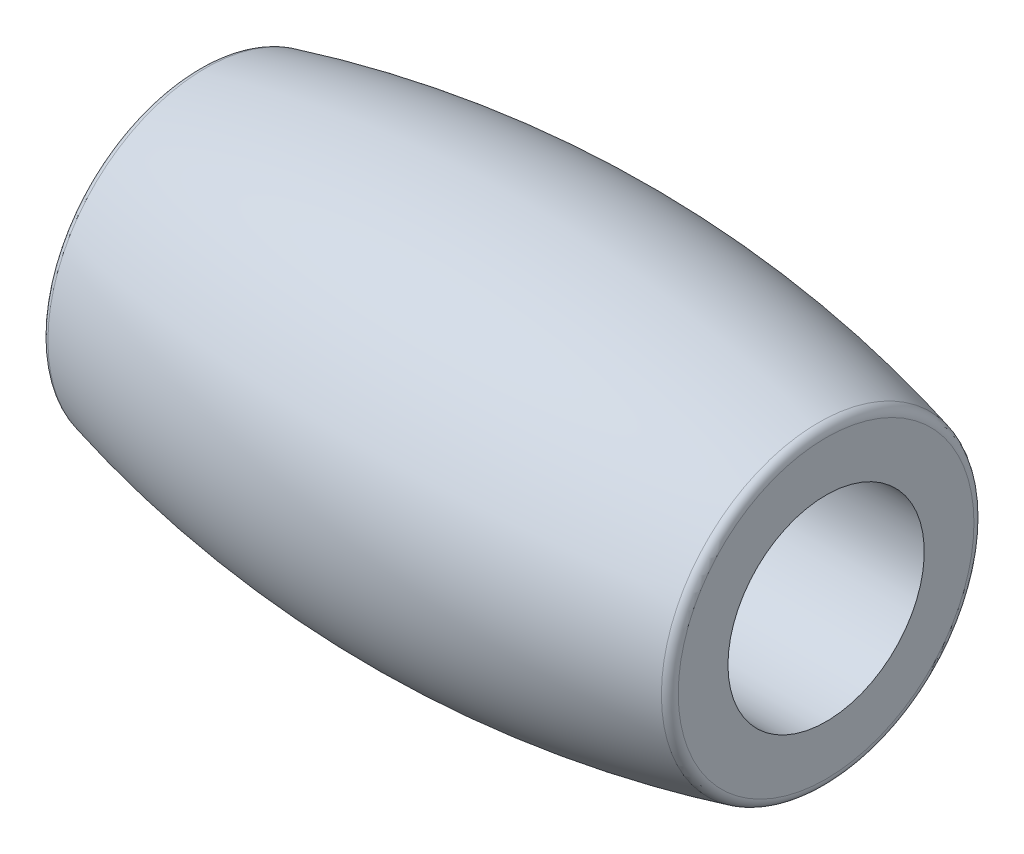
ISO-10303-21;
HEADER;
FILE_DESCRIPTION(('STEP AP214'),'2;1');
FILE_NAME('part.step','',(''),(''),'','','');
FILE_SCHEMA(('AUTOMOTIVE_DESIGN { 1 0 10303 214 1 1 1 1 }'));
ENDSEC;
DATA;
#1=APPLICATION_CONTEXT('core data for automotive mechanical design processes');
#2=APPLICATION_PROTOCOL_DEFINITION('international standard','automotive_design',2000,#1);
#3=PRODUCT_CONTEXT('',#1,'mechanical');
#4=PRODUCT('Part','Part','',(#3));
#5=PRODUCT_RELATED_PRODUCT_CATEGORY('part','',(#4));
#6=PRODUCT_DEFINITION_FORMATION('','',#4);
#7=PRODUCT_DEFINITION_CONTEXT('part definition',#1,'design');
#8=PRODUCT_DEFINITION('design','',#6,#7);
#9=PRODUCT_DEFINITION_SHAPE('','',#8);
#10=(LENGTH_UNIT() NAMED_UNIT(*) SI_UNIT(.MILLI.,.METRE.));
#11=(NAMED_UNIT(*) PLANE_ANGLE_UNIT() SI_UNIT($,.RADIAN.));
#12=(NAMED_UNIT(*) SI_UNIT($,.STERADIAN.) SOLID_ANGLE_UNIT());
#13=UNCERTAINTY_MEASURE_WITH_UNIT(LENGTH_MEASURE(1.E-05),#10,'distance_accuracy_value','');
#14=(GEOMETRIC_REPRESENTATION_CONTEXT(3) GLOBAL_UNCERTAINTY_ASSIGNED_CONTEXT((#13)) GLOBAL_UNIT_ASSIGNED_CONTEXT((#10,
#11,#12)) REPRESENTATION_CONTEXT('',''));
#15=CARTESIAN_POINT('',(0.,0.,0.));
#16=DIRECTION('',(0.,0.,1.));
#17=DIRECTION('',(1.,0.,0.));
#18=AXIS2_PLACEMENT_3D('',#15,#16,#17);
#19=CARTESIAN_POINT('',(0.,52.5,0.));
#20=DIRECTION('',(-1.,0.,0.));
#21=DIRECTION('',(0.,0.,1.));
#22=AXIS2_PLACEMENT_3D('',#19,#20,#21);
#23=DEGENERATE_TOROIDAL_SURFACE('',#22,52.5,62.5,.F.);
#24=CARTESIAN_POINT('',(15.625,52.5,0.));
#25=DIRECTION('',(-1.,0.,0.));
#26=DIRECTION('',(0.,0.,1.));
#27=AXIS2_PLACEMENT_3D('',#24,#25,#26);
#28=CIRCLE('',#27,8.01536478449089);
#29=CARTESIAN_POINT('',(15.625,52.5,8.01536478449089));
#30=VERTEX_POINT('',#29);
#31=EDGE_CURVE('E45',#30,#30,#28,.T.);
#32=ORIENTED_EDGE('',*,*,#31,.T.);
#33=EDGE_LOOP('',(#32));
#34=FACE_BOUND('',#33,.T.);
#35=CARTESIAN_POINT('',(-15.625,52.5,0.));
#36=DIRECTION('',(1.,0.,0.));
#37=DIRECTION('',(0.,0.,-1.));
#38=AXIS2_PLACEMENT_3D('',#35,#36,#37);
#39=CIRCLE('',#38,8.01536478449089);
#40=CARTESIAN_POINT('',(-15.625,52.5,-8.01536478449089));
#41=VERTEX_POINT('',#40);
#42=EDGE_CURVE('E49',#41,#41,#39,.T.);
#43=ORIENTED_EDGE('',*,*,#42,.T.);
#44=EDGE_LOOP('',(#43));
#45=FACE_BOUND('',#44,.T.);
#46=ADVANCED_FACE('F34',(#34,#45),#23,.F.);
#47=CARTESIAN_POINT('',(-16.,47.5,0.));
#48=DIRECTION('',(1.,0.,0.));
#49=DIRECTION('',(0.,0.,-1.));
#50=AXIS2_PLACEMENT_3D('',#47,#48,#49);
#51=PLANE('',#50);
#52=CARTESIAN_POINT('',(-16.,52.5,0.));
#53=DIRECTION('',(1.,0.,0.));
#54=DIRECTION('',(0.,0.,-1.));
#55=AXIS2_PLACEMENT_3D('',#52,#53,#54);
#56=CIRCLE('',#55,7.53124186621496);
#57=CARTESIAN_POINT('',(-16.,52.5,-7.53124186621496));
#58=VERTEX_POINT('',#57);
#59=EDGE_CURVE('E10',#58,#58,#56,.F.);
#60=ORIENTED_EDGE('',*,*,#59,.T.);
#61=EDGE_LOOP('',(#60));
#62=FACE_BOUND('',#61,.T.);
#63=CARTESIAN_POINT('',(-16.,52.5,0.));
#64=DIRECTION('',(-1.,0.,0.));
#65=DIRECTION('',(0.,0.,1.));
#66=AXIS2_PLACEMENT_3D('',#63,#64,#65);
#67=CIRCLE('',#66,5.);
#68=CARTESIAN_POINT('',(-16.,52.5,5.));
#69=VERTEX_POINT('',#68);
#70=EDGE_CURVE('E54',#69,#69,#67,.T.);
#71=ORIENTED_EDGE('',*,*,#70,.F.);
#72=EDGE_LOOP('',(#71));
#73=FACE_BOUND('',#72,.T.);
#74=ADVANCED_FACE('F66',(#62,#73),#51,.F.);
#75=CARTESIAN_POINT('',(-16.,52.5,0.));
#76=DIRECTION('',(-1.,0.,0.));
#77=DIRECTION('',(0.,0.,1.));
#78=AXIS2_PLACEMENT_3D('',#75,#76,#77);
#79=CYLINDRICAL_SURFACE('',#78,5.);
#80=CARTESIAN_POINT('',(16.,52.5,0.));
#81=DIRECTION('',(-1.,0.,0.));
#82=DIRECTION('',(0.,0.,1.));
#83=AXIS2_PLACEMENT_3D('',#80,#81,#82);
#84=CIRCLE('',#83,5.);
#85=CARTESIAN_POINT('',(16.,52.5,5.));
#86=VERTEX_POINT('',#85);
#87=EDGE_CURVE('E57',#86,#86,#84,.T.);
#88=ORIENTED_EDGE('',*,*,#87,.F.);
#89=EDGE_LOOP('',(#88));
#90=FACE_BOUND('',#89,.T.);
#91=ORIENTED_EDGE('',*,*,#70,.T.);
#92=EDGE_LOOP('',(#91));
#93=FACE_BOUND('',#92,.T.);
#94=ADVANCED_FACE('F63',(#90,#93),#79,.F.);
#95=CARTESIAN_POINT('',(16.,47.5,0.));
#96=DIRECTION('',(-1.,0.,0.));
#97=DIRECTION('',(0.,0.,1.));
#98=AXIS2_PLACEMENT_3D('',#95,#96,#97);
#99=PLANE('',#98);
#100=CARTESIAN_POINT('',(16.,52.5,0.));
#101=DIRECTION('',(-1.,0.,0.));
#102=DIRECTION('',(0.,0.,1.));
#103=AXIS2_PLACEMENT_3D('',#100,#101,#102);
#104=CIRCLE('',#103,7.53124186621496);
#105=CARTESIAN_POINT('',(16.,52.5,7.53124186621496));
#106=VERTEX_POINT('',#105);
#107=EDGE_CURVE('E41',#106,#106,#104,.F.);
#108=ORIENTED_EDGE('',*,*,#107,.T.);
#109=EDGE_LOOP('',(#108));
#110=FACE_BOUND('',#109,.T.);
#111=ORIENTED_EDGE('',*,*,#87,.T.);
#112=EDGE_LOOP('',(#111));
#113=FACE_BOUND('',#112,.T.);
#114=ADVANCED_FACE('F61',(#110,#113),#99,.F.);
#115=CARTESIAN_POINT('',(15.5,52.5,0.));
#116=DIRECTION('',(-1.,0.,0.));
#117=DIRECTION('',(0.,0.,1.));
#118=AXIS2_PLACEMENT_3D('',#115,#116,#117);
#119=TOROIDAL_SURFACE('',#118,7.53124186621496,0.5);
#120=ORIENTED_EDGE('',*,*,#107,.F.);
#121=EDGE_LOOP('',(#120));
#122=FACE_BOUND('',#121,.T.);
#123=ORIENTED_EDGE('',*,*,#31,.F.);
#124=EDGE_LOOP('',(#123));
#125=FACE_BOUND('',#124,.T.);
#126=ADVANCED_FACE('F78',(#122,#125),#119,.T.);
#127=CARTESIAN_POINT('',(-15.5,52.5,0.));
#128=DIRECTION('',(1.,0.,0.));
#129=DIRECTION('',(0.,0.,-1.));
#130=AXIS2_PLACEMENT_3D('',#127,#128,#129);
#131=TOROIDAL_SURFACE('',#130,7.53124186621496,0.5);
#132=ORIENTED_EDGE('',*,*,#42,.F.);
#133=EDGE_LOOP('',(#132));
#134=FACE_BOUND('',#133,.T.);
#135=ORIENTED_EDGE('',*,*,#59,.F.);
#136=EDGE_LOOP('',(#135));
#137=FACE_BOUND('',#136,.T.);
#138=ADVANCED_FACE('F36',(#134,#137),#131,.T.);
#139=CLOSED_SHELL('',(#46,#74,#94,#114,#126,#138));
#140=MANIFOLD_SOLID_BREP('B2',#139);
#141=ADVANCED_BREP_SHAPE_REPRESENTATION('',(#18,#140),#14);
#142=SHAPE_DEFINITION_REPRESENTATION(#9,#141);
ENDSEC;
END-ISO-10303-21;
